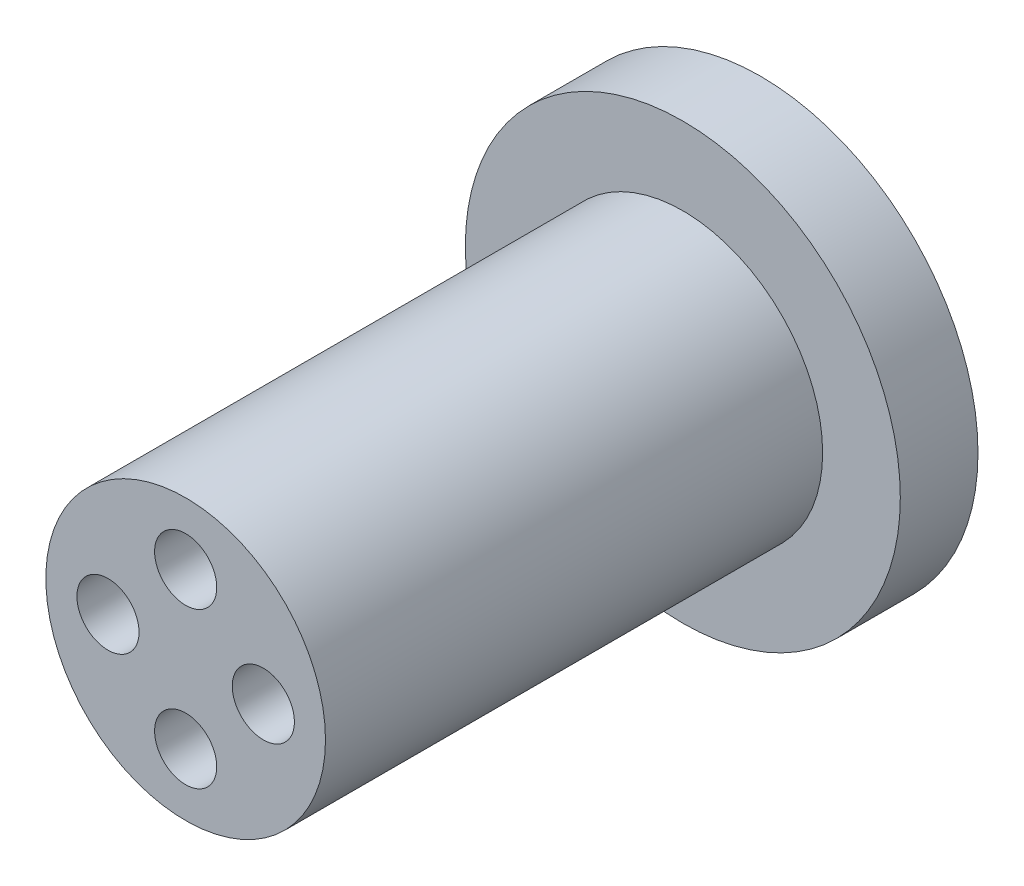
ISO-10303-21;
HEADER;
FILE_DESCRIPTION(('STEP AP214'),'2;1');
FILE_NAME('part.step','',(''),(''),'','','');
FILE_SCHEMA(('AUTOMOTIVE_DESIGN { 1 0 10303 214 1 1 1 1 }'));
ENDSEC;
DATA;
#1=APPLICATION_CONTEXT('core data for automotive mechanical design processes');
#2=APPLICATION_PROTOCOL_DEFINITION('international standard','automotive_design',2000,#1);
#3=PRODUCT_CONTEXT('',#1,'mechanical');
#4=PRODUCT('Part','Part','',(#3));
#5=PRODUCT_RELATED_PRODUCT_CATEGORY('part','',(#4));
#6=PRODUCT_DEFINITION_FORMATION('','',#4);
#7=PRODUCT_DEFINITION_CONTEXT('part definition',#1,'design');
#8=PRODUCT_DEFINITION('design','',#6,#7);
#9=PRODUCT_DEFINITION_SHAPE('','',#8);
#10=(LENGTH_UNIT() NAMED_UNIT(*) SI_UNIT(.MILLI.,.METRE.));
#11=(NAMED_UNIT(*) PLANE_ANGLE_UNIT() SI_UNIT($,.RADIAN.));
#12=(NAMED_UNIT(*) SI_UNIT($,.STERADIAN.) SOLID_ANGLE_UNIT());
#13=UNCERTAINTY_MEASURE_WITH_UNIT(LENGTH_MEASURE(1.E-05),#10,'distance_accuracy_value','');
#14=(GEOMETRIC_REPRESENTATION_CONTEXT(3) GLOBAL_UNCERTAINTY_ASSIGNED_CONTEXT((#13)) GLOBAL_UNIT_ASSIGNED_CONTEXT((#10,
#11,#12)) REPRESENTATION_CONTEXT('',''));
#15=CARTESIAN_POINT('',(0.,0.,0.));
#16=DIRECTION('',(0.,0.,1.));
#17=DIRECTION('',(1.,0.,0.));
#18=AXIS2_PLACEMENT_3D('',#15,#16,#17);
#19=CARTESIAN_POINT('',(0.,0.,2.5));
#20=DIRECTION('',(0.,0.,-1.));
#21=DIRECTION('',(-1.,0.,0.));
#22=AXIS2_PLACEMENT_3D('',#19,#20,#21);
#23=CYLINDRICAL_SURFACE('',#22,7.);
#24=CARTESIAN_POINT('',(0.,0.,2.5));
#25=DIRECTION('',(0.,0.,1.));
#26=DIRECTION('',(1.,0.,0.));
#27=AXIS2_PLACEMENT_3D('',#24,#25,#26);
#28=CIRCLE('',#27,7.);
#29=CARTESIAN_POINT('',(7.,0.,2.5));
#30=VERTEX_POINT('',#29);
#31=EDGE_CURVE('E41',#30,#30,#28,.T.);
#32=ORIENTED_EDGE('',*,*,#31,.F.);
#33=EDGE_LOOP('',(#32));
#34=FACE_BOUND('',#33,.T.);
#35=CARTESIAN_POINT('',(0.,0.,0.));
#36=DIRECTION('',(0.,0.,1.));
#37=DIRECTION('',(1.,0.,0.));
#38=AXIS2_PLACEMENT_3D('',#35,#36,#37);
#39=CIRCLE('',#38,7.);
#40=CARTESIAN_POINT('',(7.,0.,0.));
#41=VERTEX_POINT('',#40);
#42=EDGE_CURVE('E37',#41,#41,#39,.T.);
#43=ORIENTED_EDGE('',*,*,#42,.T.);
#44=EDGE_LOOP('',(#43));
#45=FACE_BOUND('',#44,.T.);
#46=ADVANCED_FACE('F34',(#34,#45),#23,.T.);
#47=CARTESIAN_POINT('',(0.,0.,2.5));
#48=DIRECTION('',(0.,0.,1.));
#49=DIRECTION('',(1.,0.,0.));
#50=AXIS2_PLACEMENT_3D('',#47,#48,#49);
#51=PLANE('',#50);
#52=CARTESIAN_POINT('',(0.,0.,2.5));
#53=DIRECTION('',(0.,0.,1.));
#54=DIRECTION('',(1.,0.,0.));
#55=AXIS2_PLACEMENT_3D('',#52,#53,#54);
#56=CIRCLE('',#55,4.5);
#57=CARTESIAN_POINT('',(4.5,0.,2.5));
#58=VERTEX_POINT('',#57);
#59=EDGE_CURVE('E10',#58,#58,#56,.T.);
#60=ORIENTED_EDGE('',*,*,#59,.F.);
#61=EDGE_LOOP('',(#60));
#62=FACE_BOUND('',#61,.T.);
#63=ORIENTED_EDGE('',*,*,#31,.T.);
#64=EDGE_LOOP('',(#63));
#65=FACE_BOUND('',#64,.T.);
#66=ADVANCED_FACE('F104',(#62,#65),#51,.T.);
#67=CARTESIAN_POINT('',(0.,0.,0.));
#68=DIRECTION('',(0.,0.,1.));
#69=DIRECTION('',(1.,0.,0.));
#70=AXIS2_PLACEMENT_3D('',#67,#68,#69);
#71=PLANE('',#70);
#72=ORIENTED_EDGE('',*,*,#42,.F.);
#73=EDGE_LOOP('',(#72));
#74=FACE_BOUND('',#73,.T.);
#75=ADVANCED_FACE('F99',(#74),#71,.F.);
#76=CARTESIAN_POINT('',(0.,0.,18.5));
#77=DIRECTION('',(0.,0.,-1.));
#78=DIRECTION('',(-1.,0.,0.));
#79=AXIS2_PLACEMENT_3D('',#76,#77,#78);
#80=CYLINDRICAL_SURFACE('',#79,4.5);
#81=CARTESIAN_POINT('',(0.,0.,18.5));
#82=DIRECTION('',(0.,0.,1.));
#83=DIRECTION('',(1.,0.,0.));
#84=AXIS2_PLACEMENT_3D('',#81,#82,#83);
#85=CIRCLE('',#84,4.5);
#86=CARTESIAN_POINT('',(4.5,0.,18.5));
#87=VERTEX_POINT('',#86);
#88=EDGE_CURVE('E47',#87,#87,#85,.T.);
#89=ORIENTED_EDGE('',*,*,#88,.F.);
#90=EDGE_LOOP('',(#89));
#91=FACE_BOUND('',#90,.T.);
#92=ORIENTED_EDGE('',*,*,#59,.T.);
#93=EDGE_LOOP('',(#92));
#94=FACE_BOUND('',#93,.T.);
#95=ADVANCED_FACE('F88',(#91,#94),#80,.T.);
#96=CARTESIAN_POINT('',(0.,0.,18.5));
#97=DIRECTION('',(0.,0.,1.));
#98=DIRECTION('',(1.,0.,0.));
#99=AXIS2_PLACEMENT_3D('',#96,#97,#98);
#100=PLANE('',#99);
#101=CARTESIAN_POINT('',(0.,2.5,18.5));
#102=DIRECTION('',(0.,0.,1.));
#103=DIRECTION('',(1.,0.,0.));
#104=AXIS2_PLACEMENT_3D('',#101,#102,#103);
#105=CIRCLE('',#104,1.);
#106=CARTESIAN_POINT('',(1.,2.5,18.5));
#107=VERTEX_POINT('',#106);
#108=EDGE_CURVE('E69',#107,#107,#105,.T.);
#109=ORIENTED_EDGE('',*,*,#108,.F.);
#110=EDGE_LOOP('',(#109));
#111=FACE_BOUND('',#110,.T.);
#112=CARTESIAN_POINT('',(2.50000000000007,0.,18.5));
#113=DIRECTION('',(0.,0.,1.));
#114=DIRECTION('',(1.,0.,0.));
#115=AXIS2_PLACEMENT_3D('',#112,#113,#114);
#116=CIRCLE('',#115,1.);
#117=CARTESIAN_POINT('',(3.50000000000007,0.,18.5));
#118=VERTEX_POINT('',#117);
#119=EDGE_CURVE('E63',#118,#118,#116,.T.);
#120=ORIENTED_EDGE('',*,*,#119,.F.);
#121=EDGE_LOOP('',(#120));
#122=FACE_BOUND('',#121,.T.);
#123=CARTESIAN_POINT('',(1.4119006205266E-13,-2.5,18.5));
#124=DIRECTION('',(0.,0.,1.));
#125=DIRECTION('',(1.,0.,0.));
#126=AXIS2_PLACEMENT_3D('',#123,#124,#125);
#127=CIRCLE('',#126,1.);
#128=CARTESIAN_POINT('',(1.00000000000014,-2.5,18.5));
#129=VERTEX_POINT('',#128);
#130=EDGE_CURVE('E57',#129,#129,#127,.T.);
#131=ORIENTED_EDGE('',*,*,#130,.F.);
#132=EDGE_LOOP('',(#131));
#133=FACE_BOUND('',#132,.T.);
#134=CARTESIAN_POINT('',(-2.49999999999993,0.,18.5));
#135=DIRECTION('',(0.,0.,1.));
#136=DIRECTION('',(1.,0.,0.));
#137=AXIS2_PLACEMENT_3D('',#134,#135,#136);
#138=CIRCLE('',#137,1.);
#139=CARTESIAN_POINT('',(-1.49999999999993,0.,18.5));
#140=VERTEX_POINT('',#139);
#141=EDGE_CURVE('E51',#140,#140,#138,.T.);
#142=ORIENTED_EDGE('',*,*,#141,.F.);
#143=EDGE_LOOP('',(#142));
#144=FACE_BOUND('',#143,.T.);
#145=ORIENTED_EDGE('',*,*,#88,.T.);
#146=EDGE_LOOP('',(#145));
#147=FACE_BOUND('',#146,.T.);
#148=ADVANCED_FACE('F84',(#111,#122,#133,#144,#147),#100,.T.);
#149=CARTESIAN_POINT('',(-2.49999999999993,0.,13.5));
#150=DIRECTION('',(0.,0.,1.));
#151=DIRECTION('',(1.,0.,0.));
#152=AXIS2_PLACEMENT_3D('',#149,#150,#151);
#153=CYLINDRICAL_SURFACE('',#152,1.);
#154=CARTESIAN_POINT('',(-2.49999999999993,0.,13.5));
#155=DIRECTION('',(0.,0.,1.));
#156=DIRECTION('',(1.,0.,0.));
#157=AXIS2_PLACEMENT_3D('',#154,#155,#156);
#158=CIRCLE('',#157,1.);
#159=CARTESIAN_POINT('',(-1.49999999999993,0.,13.5));
#160=VERTEX_POINT('',#159);
#161=EDGE_CURVE('E54',#160,#160,#158,.T.);
#162=ORIENTED_EDGE('',*,*,#161,.F.);
#163=EDGE_LOOP('',(#162));
#164=FACE_BOUND('',#163,.T.);
#165=ORIENTED_EDGE('',*,*,#141,.T.);
#166=EDGE_LOOP('',(#165));
#167=FACE_BOUND('',#166,.T.);
#168=ADVANCED_FACE('F87',(#164,#167),#153,.F.);
#169=CARTESIAN_POINT('',(-2.49999999999993,0.,13.5));
#170=DIRECTION('',(0.,0.,1.));
#171=DIRECTION('',(1.,0.,0.));
#172=AXIS2_PLACEMENT_3D('',#169,#170,#171);
#173=PLANE('',#172);
#174=ORIENTED_EDGE('',*,*,#161,.T.);
#175=EDGE_LOOP('',(#174));
#176=FACE_BOUND('',#175,.T.);
#177=ADVANCED_FACE('F149',(#176),#173,.T.);
#178=CARTESIAN_POINT('',(1.4119006205266E-13,-2.5,13.5));
#179=DIRECTION('',(0.,0.,1.));
#180=DIRECTION('',(1.,0.,0.));
#181=AXIS2_PLACEMENT_3D('',#178,#179,#180);
#182=CYLINDRICAL_SURFACE('',#181,1.);
#183=CARTESIAN_POINT('',(1.4119006205266E-13,-2.5,13.5));
#184=DIRECTION('',(0.,0.,1.));
#185=DIRECTION('',(1.,0.,0.));
#186=AXIS2_PLACEMENT_3D('',#183,#184,#185);
#187=CIRCLE('',#186,1.);
#188=CARTESIAN_POINT('',(1.00000000000014,-2.5,13.5));
#189=VERTEX_POINT('',#188);
#190=EDGE_CURVE('E60',#189,#189,#187,.T.);
#191=ORIENTED_EDGE('',*,*,#190,.F.);
#192=EDGE_LOOP('',(#191));
#193=FACE_BOUND('',#192,.T.);
#194=ORIENTED_EDGE('',*,*,#130,.T.);
#195=EDGE_LOOP('',(#194));
#196=FACE_BOUND('',#195,.T.);
#197=ADVANCED_FACE('F158',(#193,#196),#182,.F.);
#198=CARTESIAN_POINT('',(1.4119006205266E-13,-2.5,13.5));
#199=DIRECTION('',(0.,0.,1.));
#200=DIRECTION('',(1.,0.,0.));
#201=AXIS2_PLACEMENT_3D('',#198,#199,#200);
#202=PLANE('',#201);
#203=ORIENTED_EDGE('',*,*,#190,.T.);
#204=EDGE_LOOP('',(#203));
#205=FACE_BOUND('',#204,.T.);
#206=ADVANCED_FACE('F167',(#205),#202,.T.);
#207=CARTESIAN_POINT('',(2.50000000000007,0.,13.5));
#208=DIRECTION('',(0.,0.,1.));
#209=DIRECTION('',(1.,0.,0.));
#210=AXIS2_PLACEMENT_3D('',#207,#208,#209);
#211=CYLINDRICAL_SURFACE('',#210,1.);
#212=CARTESIAN_POINT('',(2.50000000000007,0.,13.5));
#213=DIRECTION('',(0.,0.,1.));
#214=DIRECTION('',(1.,0.,0.));
#215=AXIS2_PLACEMENT_3D('',#212,#213,#214);
#216=CIRCLE('',#215,1.);
#217=CARTESIAN_POINT('',(3.50000000000007,0.,13.5));
#218=VERTEX_POINT('',#217);
#219=EDGE_CURVE('E66',#218,#218,#216,.T.);
#220=ORIENTED_EDGE('',*,*,#219,.F.);
#221=EDGE_LOOP('',(#220));
#222=FACE_BOUND('',#221,.T.);
#223=ORIENTED_EDGE('',*,*,#119,.T.);
#224=EDGE_LOOP('',(#223));
#225=FACE_BOUND('',#224,.T.);
#226=ADVANCED_FACE('F176',(#222,#225),#211,.F.);
#227=CARTESIAN_POINT('',(2.50000000000007,0.,13.5));
#228=DIRECTION('',(0.,0.,1.));
#229=DIRECTION('',(1.,0.,0.));
#230=AXIS2_PLACEMENT_3D('',#227,#228,#229);
#231=PLANE('',#230);
#232=ORIENTED_EDGE('',*,*,#219,.T.);
#233=EDGE_LOOP('',(#232));
#234=FACE_BOUND('',#233,.T.);
#235=ADVANCED_FACE('F80',(#234),#231,.T.);
#236=CARTESIAN_POINT('',(0.,2.5,13.5));
#237=DIRECTION('',(0.,0.,1.));
#238=DIRECTION('',(1.,0.,0.));
#239=AXIS2_PLACEMENT_3D('',#236,#237,#238);
#240=CYLINDRICAL_SURFACE('',#239,1.);
#241=CARTESIAN_POINT('',(0.,2.5,13.5));
#242=DIRECTION('',(0.,0.,1.));
#243=DIRECTION('',(1.,0.,0.));
#244=AXIS2_PLACEMENT_3D('',#241,#242,#243);
#245=CIRCLE('',#244,1.);
#246=CARTESIAN_POINT('',(1.,2.5,13.5));
#247=VERTEX_POINT('',#246);
#248=EDGE_CURVE('E50',#247,#247,#245,.T.);
#249=ORIENTED_EDGE('',*,*,#248,.F.);
#250=EDGE_LOOP('',(#249));
#251=FACE_BOUND('',#250,.T.);
#252=ORIENTED_EDGE('',*,*,#108,.T.);
#253=EDGE_LOOP('',(#252));
#254=FACE_BOUND('',#253,.T.);
#255=ADVANCED_FACE('F77',(#251,#254),#240,.F.);
#256=CARTESIAN_POINT('',(0.,2.5,13.5));
#257=DIRECTION('',(0.,0.,1.));
#258=DIRECTION('',(1.,0.,0.));
#259=AXIS2_PLACEMENT_3D('',#256,#257,#258);
#260=PLANE('',#259);
#261=ORIENTED_EDGE('',*,*,#248,.T.);
#262=EDGE_LOOP('',(#261));
#263=FACE_BOUND('',#262,.T.);
#264=ADVANCED_FACE('F75',(#263),#260,.T.);
#265=CLOSED_SHELL('',(#46,#66,#75,#95,#148,#168,#177,#197,#206,#226,#235,#255,#264));
#266=MANIFOLD_SOLID_BREP('B2',#265);
#267=ADVANCED_BREP_SHAPE_REPRESENTATION('',(#18,#266),#14);
#268=SHAPE_DEFINITION_REPRESENTATION(#9,#267);
ENDSEC;
END-ISO-10303-21;
